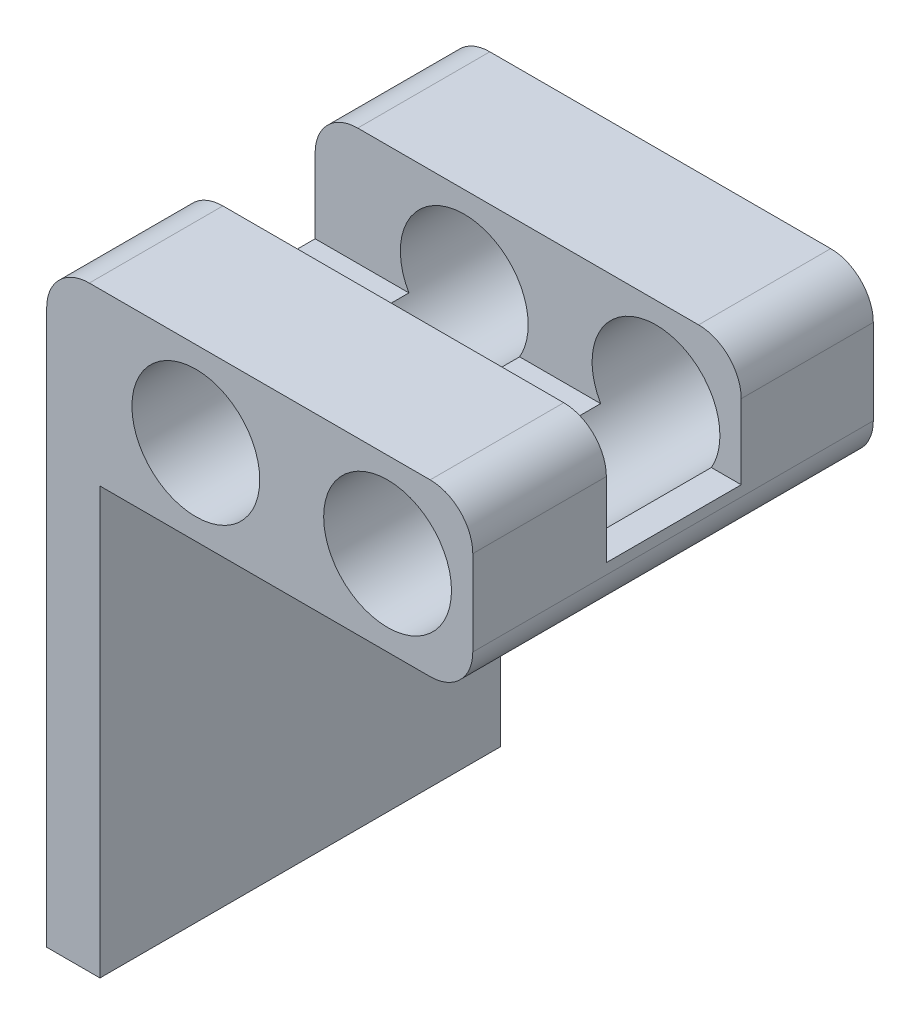
ISO-10303-21;
HEADER;
FILE_DESCRIPTION(('STEP AP214'),'2;1');
FILE_NAME('part.step','',(''),(''),'','','');
FILE_SCHEMA(('AUTOMOTIVE_DESIGN { 1 0 10303 214 1 1 1 1 }'));
ENDSEC;
DATA;
#1=APPLICATION_CONTEXT('core data for automotive mechanical design processes');
#2=APPLICATION_PROTOCOL_DEFINITION('international standard','automotive_design',2000,#1);
#3=PRODUCT_CONTEXT('',#1,'mechanical');
#4=PRODUCT('Part','Part','',(#3));
#5=PRODUCT_RELATED_PRODUCT_CATEGORY('part','',(#4));
#6=PRODUCT_DEFINITION_FORMATION('','',#4);
#7=PRODUCT_DEFINITION_CONTEXT('part definition',#1,'design');
#8=PRODUCT_DEFINITION('design','',#6,#7);
#9=PRODUCT_DEFINITION_SHAPE('','',#8);
#10=(LENGTH_UNIT() NAMED_UNIT(*) SI_UNIT(.MILLI.,.METRE.));
#11=(NAMED_UNIT(*) PLANE_ANGLE_UNIT() SI_UNIT($,.RADIAN.));
#12=(NAMED_UNIT(*) SI_UNIT($,.STERADIAN.) SOLID_ANGLE_UNIT());
#13=UNCERTAINTY_MEASURE_WITH_UNIT(LENGTH_MEASURE(1.E-05),#10,'distance_accuracy_value','');
#14=(GEOMETRIC_REPRESENTATION_CONTEXT(3) GLOBAL_UNCERTAINTY_ASSIGNED_CONTEXT((#13)) GLOBAL_UNIT_ASSIGNED_CONTEXT((#10,
#11,#12)) REPRESENTATION_CONTEXT('',''));
#15=CARTESIAN_POINT('',(0.,0.,0.));
#16=DIRECTION('',(0.,0.,1.));
#17=DIRECTION('',(1.,0.,0.));
#18=AXIS2_PLACEMENT_3D('',#15,#16,#17);
#19=CARTESIAN_POINT('',(0.,28.575,0.));
#20=DIRECTION('',(0.,1.,0.));
#21=DIRECTION('',(0.,0.,1.));
#22=AXIS2_PLACEMENT_3D('',#19,#20,#21);
#23=PLANE('',#22);
#24=DIRECTION('',(0.,0.,1.));
#25=VECTOR('',#24,1.);
#26=CARTESIAN_POINT('',(5.59044321158129,28.575,-23.876));
#27=LINE('',#26,#25);
#28=CARTESIAN_POINT('',(5.59044321158129,28.575,-16.002));
#29=VERTEX_POINT('',#28);
#30=CARTESIAN_POINT('',(5.59044321158129,28.575,-7.9629));
#31=VERTEX_POINT('',#30);
#32=EDGE_CURVE('E389',#29,#31,#27,.T.);
#33=ORIENTED_EDGE('',*,*,#32,.F.);
#34=DIRECTION('',(1.,0.,0.));
#35=VECTOR('',#34,1.);
#36=CARTESIAN_POINT('',(0.,28.575,-16.002));
#37=LINE('',#36,#35);
#38=CARTESIAN_POINT('',(0.,28.575,-16.002));
#39=VERTEX_POINT('',#38);
#40=EDGE_CURVE('E206',#39,#29,#37,.T.);
#41=ORIENTED_EDGE('',*,*,#40,.F.);
#42=DIRECTION('',(0.,0.,1.));
#43=VECTOR('',#42,1.);
#44=CARTESIAN_POINT('',(0.,28.575,-23.876));
#45=LINE('',#44,#43);
#46=CARTESIAN_POINT('',(0.,28.575,-7.9629));
#47=VERTEX_POINT('',#46);
#48=EDGE_CURVE('E240',#39,#47,#45,.T.);
#49=ORIENTED_EDGE('',*,*,#48,.T.);
#50=DIRECTION('',(-1.,0.,0.));
#51=VECTOR('',#50,1.);
#52=CARTESIAN_POINT('',(0.,28.575,-7.9629));
#53=LINE('',#52,#51);
#54=EDGE_CURVE('E211',#31,#47,#53,.T.);
#55=ORIENTED_EDGE('',*,*,#54,.F.);
#56=EDGE_LOOP('',(#33,#41,#49,#55));
#57=FACE_BOUND('',#56,.T.);
#58=ADVANCED_FACE('F43',(#57),#23,.T.);
#59=DIRECTION('',(0.,0.,1.));
#60=VECTOR('',#59,1.);
#61=CARTESIAN_POINT('',(12.1895567884187,28.575,-23.876));
#62=LINE('',#61,#60);
#63=CARTESIAN_POINT('',(12.1895567884187,28.575,-7.9629));
#64=VERTEX_POINT('',#63);
#65=CARTESIAN_POINT('',(12.1895567884187,28.575,-16.002));
#66=VERTEX_POINT('',#65);
#67=EDGE_CURVE('E403',#64,#66,#62,.F.);
#68=ORIENTED_EDGE('',*,*,#67,.F.);
#69=CARTESIAN_POINT('',(17.0204432115813,28.575,-7.9629));
#70=VERTEX_POINT('',#69);
#71=EDGE_CURVE('E197',#70,#64,#53,.T.);
#72=ORIENTED_EDGE('',*,*,#71,.F.);
#73=DIRECTION('',(0.,0.,1.));
#74=VECTOR('',#73,1.);
#75=CARTESIAN_POINT('',(17.0204432115813,28.575,-23.876));
#76=LINE('',#75,#74);
#77=CARTESIAN_POINT('',(17.0204432115813,28.575,-16.002));
#78=VERTEX_POINT('',#77);
#79=EDGE_CURVE('E178',#78,#70,#76,.T.);
#80=ORIENTED_EDGE('',*,*,#79,.F.);
#81=EDGE_CURVE('E195',#66,#78,#37,.T.);
#82=ORIENTED_EDGE('',*,*,#81,.F.);
#83=EDGE_LOOP('',(#68,#72,#80,#82));
#84=FACE_BOUND('',#83,.T.);
#85=ADVANCED_FACE('F194',(#84),#23,.T.);
#86=DIRECTION('',(0.,0.,1.));
#87=VECTOR('',#86,1.);
#88=CARTESIAN_POINT('',(23.6195567884187,28.575,-23.876));
#89=LINE('',#88,#87);
#90=CARTESIAN_POINT('',(23.6195567884187,28.575,-7.9629));
#91=VERTEX_POINT('',#90);
#92=CARTESIAN_POINT('',(23.6195567884187,28.575,-16.002));
#93=VERTEX_POINT('',#92);
#94=EDGE_CURVE('E181',#91,#93,#89,.F.);
#95=ORIENTED_EDGE('',*,*,#94,.F.);
#96=CARTESIAN_POINT('',(25.4,28.575,-7.9629));
#97=VERTEX_POINT('',#96);
#98=EDGE_CURVE('E227',#97,#91,#53,.T.);
#99=ORIENTED_EDGE('',*,*,#98,.F.);
#100=DIRECTION('',(0.,0.,-1.));
#101=VECTOR('',#100,1.);
#102=CARTESIAN_POINT('',(25.4,28.575,-23.876));
#103=LINE('',#102,#101);
#104=CARTESIAN_POINT('',(25.4,28.575,-16.002));
#105=VERTEX_POINT('',#104);
#106=EDGE_CURVE('E244',#97,#105,#103,.T.);
#107=ORIENTED_EDGE('',*,*,#106,.T.);
#108=EDGE_CURVE('E207',#93,#105,#37,.T.);
#109=ORIENTED_EDGE('',*,*,#108,.F.);
#110=EDGE_LOOP('',(#95,#99,#107,#109));
#111=FACE_BOUND('',#110,.T.);
#112=ADVANCED_FACE('F437',(#111),#23,.T.);
#113=CARTESIAN_POINT('',(3.175,0.,0.));
#114=DIRECTION('',(0.,0.,-1.));
#115=DIRECTION('',(-1.,0.,0.));
#116=AXIS2_PLACEMENT_3D('',#113,#114,#115);
#117=PLANE('',#116);
#118=CARTESIAN_POINT('',(8.89,30.48,0.));
#119=DIRECTION('',(0.,0.,-1.));
#120=DIRECTION('',(-1.,0.,0.));
#121=AXIS2_PLACEMENT_3D('',#118,#119,#120);
#122=CIRCLE('',#121,3.81);
#123=CARTESIAN_POINT('',(5.08,30.48,0.));
#124=VERTEX_POINT('',#123);
#125=EDGE_CURVE('E392',#124,#124,#122,.T.);
#126=ORIENTED_EDGE('',*,*,#125,.T.);
#127=EDGE_LOOP('',(#126));
#128=FACE_BOUND('',#127,.T.);
#129=CARTESIAN_POINT('',(20.32,30.48,0.));
#130=DIRECTION('',(0.,0.,-1.));
#131=DIRECTION('',(-1.,0.,0.));
#132=AXIS2_PLACEMENT_3D('',#129,#130,#131);
#133=CIRCLE('',#132,3.81);
#134=CARTESIAN_POINT('',(16.51,30.48,0.));
#135=VERTEX_POINT('',#134);
#136=EDGE_CURVE('E406',#135,#135,#133,.T.);
#137=ORIENTED_EDGE('',*,*,#136,.T.);
#138=EDGE_LOOP('',(#137));
#139=FACE_BOUND('',#138,.T.);
#140=DIRECTION('',(0.,-1.,0.));
#141=VECTOR('',#140,1.);
#142=CARTESIAN_POINT('',(25.4,28.575,0.));
#143=LINE('',#142,#141);
#144=CARTESIAN_POINT('',(25.4,33.02,0.));
#145=VERTEX_POINT('',#144);
#146=CARTESIAN_POINT('',(25.4,27.94,0.));
#147=VERTEX_POINT('',#146);
#148=EDGE_CURVE('E257',#145,#147,#143,.T.);
#149=ORIENTED_EDGE('',*,*,#148,.F.);
#150=CARTESIAN_POINT('',(22.86,33.02,0.));
#151=DIRECTION('',(0.,0.,-1.));
#152=DIRECTION('',(-1.,0.,0.));
#153=AXIS2_PLACEMENT_3D('',#150,#151,#152);
#154=CIRCLE('',#153,2.54);
#155=CARTESIAN_POINT('',(22.86,35.56,0.));
#156=VERTEX_POINT('',#155);
#157=EDGE_CURVE('E11',#145,#156,#154,.F.);
#158=ORIENTED_EDGE('',*,*,#157,.T.);
#159=DIRECTION('',(1.,0.,0.));
#160=VECTOR('',#159,1.);
#161=CARTESIAN_POINT('',(0.,35.56,0.));
#162=LINE('',#161,#160);
#163=CARTESIAN_POINT('',(2.54,35.56,0.));
#164=VERTEX_POINT('',#163);
#165=EDGE_CURVE('E223',#164,#156,#162,.T.);
#166=ORIENTED_EDGE('',*,*,#165,.F.);
#167=CARTESIAN_POINT('',(2.54,33.02,0.));
#168=DIRECTION('',(0.,0.,-1.));
#169=DIRECTION('',(-1.,0.,0.));
#170=AXIS2_PLACEMENT_3D('',#167,#168,#169);
#171=CIRCLE('',#170,2.54);
#172=CARTESIAN_POINT('',(0.,33.02,0.));
#173=VERTEX_POINT('',#172);
#174=EDGE_CURVE('E315',#164,#173,#171,.F.);
#175=ORIENTED_EDGE('',*,*,#174,.T.);
#176=DIRECTION('',(0.,-1.,0.));
#177=VECTOR('',#176,1.);
#178=CARTESIAN_POINT('',(0.,0.,0.));
#179=LINE('',#178,#177);
#180=CARTESIAN_POINT('',(0.,0.,0.));
#181=VERTEX_POINT('',#180);
#182=EDGE_CURVE('E260',#173,#181,#179,.T.);
#183=ORIENTED_EDGE('',*,*,#182,.T.);
#184=DIRECTION('',(-1.,0.,0.));
#185=VECTOR('',#184,1.);
#186=CARTESIAN_POINT('',(3.175,0.,0.));
#187=LINE('',#186,#185);
#188=CARTESIAN_POINT('',(3.175,0.,0.));
#189=VERTEX_POINT('',#188);
#190=EDGE_CURVE('E188',#189,#181,#187,.T.);
#191=ORIENTED_EDGE('',*,*,#190,.F.);
#192=DIRECTION('',(0.,-1.,0.));
#193=VECTOR('',#192,1.);
#194=CARTESIAN_POINT('',(3.175,0.,0.));
#195=LINE('',#194,#193);
#196=CARTESIAN_POINT('',(3.175,25.4,0.));
#197=VERTEX_POINT('',#196);
#198=EDGE_CURVE('E261',#197,#189,#195,.T.);
#199=ORIENTED_EDGE('',*,*,#198,.F.);
#200=DIRECTION('',(1.,0.,0.));
#201=VECTOR('',#200,1.);
#202=CARTESIAN_POINT('',(0.,25.4,0.));
#203=LINE('',#202,#201);
#204=CARTESIAN_POINT('',(22.86,25.4,0.));
#205=VERTEX_POINT('',#204);
#206=EDGE_CURVE('E239',#197,#205,#203,.T.);
#207=ORIENTED_EDGE('',*,*,#206,.T.);
#208=CARTESIAN_POINT('',(22.86,27.94,0.));
#209=DIRECTION('',(0.,0.,-1.));
#210=DIRECTION('',(-1.,0.,0.));
#211=AXIS2_PLACEMENT_3D('',#208,#209,#210);
#212=CIRCLE('',#211,2.54);
#213=EDGE_CURVE('E332',#205,#147,#212,.F.);
#214=ORIENTED_EDGE('',*,*,#213,.T.);
#215=EDGE_LOOP('',(#149,#158,#166,#175,#183,#191,#199,#207,#214));
#216=FACE_BOUND('',#215,.T.);
#217=ADVANCED_FACE('F367',(#128,#139,#216),#117,.F.);
#218=CARTESIAN_POINT('',(3.175,0.,0.));
#219=DIRECTION('',(0.,1.,0.));
#220=DIRECTION('',(0.,0.,1.));
#221=AXIS2_PLACEMENT_3D('',#218,#219,#220);
#222=PLANE('',#221);
#223=DIRECTION('',(0.,0.,-1.));
#224=VECTOR('',#223,1.);
#225=CARTESIAN_POINT('',(0.,0.,0.));
#226=LINE('',#225,#224);
#227=CARTESIAN_POINT('',(0.,0.,-23.876));
#228=VERTEX_POINT('',#227);
#229=EDGE_CURVE('E280',#181,#228,#226,.T.);
#230=ORIENTED_EDGE('',*,*,#229,.T.);
#231=DIRECTION('',(-1.,0.,0.));
#232=VECTOR('',#231,1.);
#233=CARTESIAN_POINT('',(3.175,0.,-23.876));
#234=LINE('',#233,#232);
#235=CARTESIAN_POINT('',(3.175,0.,-23.876));
#236=VERTEX_POINT('',#235);
#237=EDGE_CURVE('E277',#236,#228,#234,.T.);
#238=ORIENTED_EDGE('',*,*,#237,.F.);
#239=DIRECTION('',(0.,0.,-1.));
#240=VECTOR('',#239,1.);
#241=CARTESIAN_POINT('',(3.175,0.,0.));
#242=LINE('',#241,#240);
#243=EDGE_CURVE('E265',#189,#236,#242,.T.);
#244=ORIENTED_EDGE('',*,*,#243,.F.);
#245=ORIENTED_EDGE('',*,*,#190,.T.);
#246=EDGE_LOOP('',(#230,#238,#244,#245));
#247=FACE_BOUND('',#246,.T.);
#248=ADVANCED_FACE('F436',(#247),#222,.F.);
#249=CARTESIAN_POINT('',(3.175,0.,-23.876));
#250=DIRECTION('',(0.,0.,1.));
#251=DIRECTION('',(1.,0.,0.));
#252=AXIS2_PLACEMENT_3D('',#249,#250,#251);
#253=PLANE('',#252);
#254=CARTESIAN_POINT('',(8.89,30.48,-23.876));
#255=DIRECTION('',(0.,0.,1.));
#256=DIRECTION('',(1.,0.,0.));
#257=AXIS2_PLACEMENT_3D('',#254,#255,#256);
#258=CIRCLE('',#257,3.81);
#259=CARTESIAN_POINT('',(12.7,30.48,-23.876));
#260=VERTEX_POINT('',#259);
#261=EDGE_CURVE('E414',#260,#260,#258,.T.);
#262=ORIENTED_EDGE('',*,*,#261,.T.);
#263=EDGE_LOOP('',(#262));
#264=FACE_BOUND('',#263,.T.);
#265=CARTESIAN_POINT('',(20.32,30.48,-23.876));
#266=DIRECTION('',(0.,0.,1.));
#267=DIRECTION('',(1.,0.,0.));
#268=AXIS2_PLACEMENT_3D('',#265,#266,#267);
#269=CIRCLE('',#268,3.81);
#270=CARTESIAN_POINT('',(24.13,30.48,-23.876));
#271=VERTEX_POINT('',#270);
#272=EDGE_CURVE('E415',#271,#271,#269,.T.);
#273=ORIENTED_EDGE('',*,*,#272,.T.);
#274=EDGE_LOOP('',(#273));
#275=FACE_BOUND('',#274,.T.);
#276=DIRECTION('',(-1.,0.,0.));
#277=VECTOR('',#276,1.);
#278=CARTESIAN_POINT('',(0.,35.56,-23.876));
#279=LINE('',#278,#277);
#280=CARTESIAN_POINT('',(22.86,35.56,-23.876));
#281=VERTEX_POINT('',#280);
#282=CARTESIAN_POINT('',(2.54,35.56,-23.876));
#283=VERTEX_POINT('',#282);
#284=EDGE_CURVE('E217',#281,#283,#279,.T.);
#285=ORIENTED_EDGE('',*,*,#284,.F.);
#286=CARTESIAN_POINT('',(22.86,33.02,-23.876));
#287=DIRECTION('',(0.,0.,1.));
#288=DIRECTION('',(1.,0.,0.));
#289=AXIS2_PLACEMENT_3D('',#286,#287,#288);
#290=CIRCLE('',#289,2.54);
#291=CARTESIAN_POINT('',(25.4,33.02,-23.876));
#292=VERTEX_POINT('',#291);
#293=EDGE_CURVE('E340',#281,#292,#290,.F.);
#294=ORIENTED_EDGE('',*,*,#293,.T.);
#295=DIRECTION('',(0.,-1.,0.));
#296=VECTOR('',#295,1.);
#297=CARTESIAN_POINT('',(25.4,28.575,-23.876));
#298=LINE('',#297,#296);
#299=CARTESIAN_POINT('',(25.4,27.94,-23.876));
#300=VERTEX_POINT('',#299);
#301=EDGE_CURVE('E249',#292,#300,#298,.T.);
#302=ORIENTED_EDGE('',*,*,#301,.T.);
#303=CARTESIAN_POINT('',(22.86,27.94,-23.876));
#304=DIRECTION('',(0.,0.,1.));
#305=DIRECTION('',(1.,0.,0.));
#306=AXIS2_PLACEMENT_3D('',#303,#304,#305);
#307=CIRCLE('',#306,2.54);
#308=CARTESIAN_POINT('',(22.86,25.4,-23.876));
#309=VERTEX_POINT('',#308);
#310=EDGE_CURVE('E326',#300,#309,#307,.F.);
#311=ORIENTED_EDGE('',*,*,#310,.T.);
#312=DIRECTION('',(-1.,0.,0.));
#313=VECTOR('',#312,1.);
#314=CARTESIAN_POINT('',(0.,25.4,-23.876));
#315=LINE('',#314,#313);
#316=CARTESIAN_POINT('',(3.175,25.4,-23.876));
#317=VERTEX_POINT('',#316);
#318=EDGE_CURVE('E245',#309,#317,#315,.T.);
#319=ORIENTED_EDGE('',*,*,#318,.T.);
#320=DIRECTION('',(0.,1.,0.));
#321=VECTOR('',#320,1.);
#322=CARTESIAN_POINT('',(3.175,0.,-23.876));
#323=LINE('',#322,#321);
#324=EDGE_CURVE('E269',#236,#317,#323,.T.);
#325=ORIENTED_EDGE('',*,*,#324,.F.);
#326=ORIENTED_EDGE('',*,*,#237,.T.);
#327=DIRECTION('',(0.,1.,0.));
#328=VECTOR('',#327,1.);
#329=CARTESIAN_POINT('',(0.,0.,-23.876));
#330=LINE('',#329,#328);
#331=CARTESIAN_POINT('',(0.,33.02,-23.876));
#332=VERTEX_POINT('',#331);
#333=EDGE_CURVE('E266',#228,#332,#330,.T.);
#334=ORIENTED_EDGE('',*,*,#333,.T.);
#335=CARTESIAN_POINT('',(2.54,33.02,-23.876));
#336=DIRECTION('',(0.,0.,1.));
#337=DIRECTION('',(1.,0.,0.));
#338=AXIS2_PLACEMENT_3D('',#335,#336,#337);
#339=CIRCLE('',#338,2.54);
#340=EDGE_CURVE('E307',#332,#283,#339,.F.);
#341=ORIENTED_EDGE('',*,*,#340,.T.);
#342=EDGE_LOOP('',(#285,#294,#302,#311,#319,#325,#326,#334,#341));
#343=FACE_BOUND('',#342,.T.);
#344=ADVANCED_FACE('F423',(#264,#275,#343),#253,.F.);
#345=CARTESIAN_POINT('',(3.175,0.,0.));
#346=DIRECTION('',(-1.,0.,0.));
#347=DIRECTION('',(0.,0.,1.));
#348=AXIS2_PLACEMENT_3D('',#345,#346,#347);
#349=PLANE('',#348);
#350=ORIENTED_EDGE('',*,*,#198,.T.);
#351=ORIENTED_EDGE('',*,*,#243,.T.);
#352=ORIENTED_EDGE('',*,*,#324,.T.);
#353=DIRECTION('',(0.,0.,1.));
#354=VECTOR('',#353,1.);
#355=CARTESIAN_POINT('',(3.175,25.4,0.));
#356=LINE('',#355,#354);
#357=EDGE_CURVE('E273',#317,#197,#356,.T.);
#358=ORIENTED_EDGE('',*,*,#357,.T.);
#359=EDGE_LOOP('',(#350,#351,#352,#358));
#360=FACE_BOUND('',#359,.T.);
#361=ADVANCED_FACE('F551',(#360),#349,.F.);
#362=CARTESIAN_POINT('',(0.,0.,0.));
#363=DIRECTION('',(-1.,0.,0.));
#364=DIRECTION('',(0.,0.,1.));
#365=AXIS2_PLACEMENT_3D('',#362,#363,#364);
#366=PLANE('',#365);
#367=DIRECTION('',(0.,-1.,0.));
#368=VECTOR('',#367,1.);
#369=CARTESIAN_POINT('',(0.,35.56,-16.002));
#370=LINE('',#369,#368);
#371=CARTESIAN_POINT('',(0.,33.02,-16.002));
#372=VERTEX_POINT('',#371);
#373=EDGE_CURVE('E384',#372,#39,#370,.T.);
#374=ORIENTED_EDGE('',*,*,#373,.F.);
#375=DIRECTION('',(0.,0.,1.));
#376=VECTOR('',#375,1.);
#377=CARTESIAN_POINT('',(0.,33.02,0.));
#378=LINE('',#377,#376);
#379=EDGE_CURVE('E304',#372,#332,#378,.F.);
#380=ORIENTED_EDGE('',*,*,#379,.T.);
#381=ORIENTED_EDGE('',*,*,#333,.F.);
#382=ORIENTED_EDGE('',*,*,#229,.F.);
#383=ORIENTED_EDGE('',*,*,#182,.F.);
#384=DIRECTION('',(0.,0.,1.));
#385=VECTOR('',#384,1.);
#386=CARTESIAN_POINT('',(0.,33.02,-7.9629));
#387=LINE('',#386,#385);
#388=CARTESIAN_POINT('',(0.,33.02,-7.9629));
#389=VERTEX_POINT('',#388);
#390=EDGE_CURVE('E301',#173,#389,#387,.F.);
#391=ORIENTED_EDGE('',*,*,#390,.T.);
#392=DIRECTION('',(0.,-1.,0.));
#393=VECTOR('',#392,1.);
#394=CARTESIAN_POINT('',(0.,35.56,-7.9629));
#395=LINE('',#394,#393);
#396=EDGE_CURVE('E230',#389,#47,#395,.T.);
#397=ORIENTED_EDGE('',*,*,#396,.T.);
#398=ORIENTED_EDGE('',*,*,#48,.F.);
#399=EDGE_LOOP('',(#374,#380,#381,#382,#383,#391,#397,#398));
#400=FACE_BOUND('',#399,.T.);
#401=ADVANCED_FACE('F375',(#400),#366,.T.);
#402=CARTESIAN_POINT('',(25.4,28.575,-23.876));
#403=DIRECTION('',(-1.,0.,0.));
#404=DIRECTION('',(0.,0.,1.));
#405=AXIS2_PLACEMENT_3D('',#402,#403,#404);
#406=PLANE('',#405);
#407=ORIENTED_EDGE('',*,*,#301,.F.);
#408=DIRECTION('',(0.,0.,-1.));
#409=VECTOR('',#408,1.);
#410=CARTESIAN_POINT('',(25.4,33.02,-16.002));
#411=LINE('',#410,#409);
#412=CARTESIAN_POINT('',(25.4,33.02,-16.002));
#413=VERTEX_POINT('',#412);
#414=EDGE_CURVE('E346',#292,#413,#411,.F.);
#415=ORIENTED_EDGE('',*,*,#414,.T.);
#416=DIRECTION('',(0.,-1.,0.));
#417=VECTOR('',#416,1.);
#418=CARTESIAN_POINT('',(25.4,35.56,-16.002));
#419=LINE('',#418,#417);
#420=EDGE_CURVE('E215',#413,#105,#419,.T.);
#421=ORIENTED_EDGE('',*,*,#420,.T.);
#422=ORIENTED_EDGE('',*,*,#106,.F.);
#423=DIRECTION('',(0.,-1.,0.));
#424=VECTOR('',#423,1.);
#425=CARTESIAN_POINT('',(25.4,35.56,-7.9629));
#426=LINE('',#425,#424);
#427=CARTESIAN_POINT('',(25.4,33.02,-7.9629));
#428=VERTEX_POINT('',#427);
#429=EDGE_CURVE('E236',#428,#97,#426,.T.);
#430=ORIENTED_EDGE('',*,*,#429,.F.);
#431=DIRECTION('',(0.,0.,-1.));
#432=VECTOR('',#431,1.);
#433=CARTESIAN_POINT('',(25.4,33.02,-23.876));
#434=LINE('',#433,#432);
#435=EDGE_CURVE('E343',#428,#145,#434,.F.);
#436=ORIENTED_EDGE('',*,*,#435,.T.);
#437=ORIENTED_EDGE('',*,*,#148,.T.);
#438=DIRECTION('',(0.,0.,-1.));
#439=VECTOR('',#438,1.);
#440=CARTESIAN_POINT('',(25.4,27.94,-23.876));
#441=LINE('',#440,#439);
#442=EDGE_CURVE('E322',#147,#300,#441,.T.);
#443=ORIENTED_EDGE('',*,*,#442,.T.);
#444=EDGE_LOOP('',(#407,#415,#421,#422,#430,#436,#437,#443));
#445=FACE_BOUND('',#444,.T.);
#446=ADVANCED_FACE('F363',(#445),#406,.F.);
#447=CARTESIAN_POINT('',(0.,25.4,0.));
#448=DIRECTION('',(0.,1.,0.));
#449=DIRECTION('',(0.,0.,1.));
#450=AXIS2_PLACEMENT_3D('',#447,#448,#449);
#451=PLANE('',#450);
#452=ORIENTED_EDGE('',*,*,#318,.F.);
#453=DIRECTION('',(0.,0.,-1.));
#454=VECTOR('',#453,1.);
#455=CARTESIAN_POINT('',(22.86,25.4,0.));
#456=LINE('',#455,#454);
#457=EDGE_CURVE('E329',#309,#205,#456,.F.);
#458=ORIENTED_EDGE('',*,*,#457,.T.);
#459=ORIENTED_EDGE('',*,*,#206,.F.);
#460=ORIENTED_EDGE('',*,*,#357,.F.);
#461=EDGE_LOOP('',(#452,#458,#459,#460));
#462=FACE_BOUND('',#461,.T.);
#463=ADVANCED_FACE('F531',(#462),#451,.F.);
#464=CARTESIAN_POINT('',(0.,35.56,-7.9629));
#465=DIRECTION('',(0.,0.,1.));
#466=DIRECTION('',(1.,0.,0.));
#467=AXIS2_PLACEMENT_3D('',#464,#465,#466);
#468=PLANE('',#467);
#469=DIRECTION('',(-1.,0.,0.));
#470=VECTOR('',#469,1.);
#471=CARTESIAN_POINT('',(0.,35.56,-7.9629));
#472=LINE('',#471,#470);
#473=CARTESIAN_POINT('',(22.86,35.56,-7.9629));
#474=VERTEX_POINT('',#473);
#475=CARTESIAN_POINT('',(2.54,35.56,-7.9629));
#476=VERTEX_POINT('',#475);
#477=EDGE_CURVE('E226',#474,#476,#472,.T.);
#478=ORIENTED_EDGE('',*,*,#477,.F.);
#479=CARTESIAN_POINT('',(22.86,33.02,-7.9629));
#480=DIRECTION('',(0.,0.,1.));
#481=DIRECTION('',(1.,0.,0.));
#482=AXIS2_PLACEMENT_3D('',#479,#480,#481);
#483=CIRCLE('',#482,2.54);
#484=EDGE_CURVE('E52',#474,#428,#483,.F.);
#485=ORIENTED_EDGE('',*,*,#484,.T.);
#486=ORIENTED_EDGE('',*,*,#429,.T.);
#487=ORIENTED_EDGE('',*,*,#98,.T.);
#488=CARTESIAN_POINT('',(20.32,30.48,-7.9629));
#489=DIRECTION('',(0.,0.,1.));
#490=DIRECTION('',(1.,0.,0.));
#491=AXIS2_PLACEMENT_3D('',#488,#489,#490);
#492=CIRCLE('',#491,3.81);
#493=EDGE_CURVE('E199',#91,#70,#492,.T.);
#494=ORIENTED_EDGE('',*,*,#493,.T.);
#495=ORIENTED_EDGE('',*,*,#71,.T.);
#496=CARTESIAN_POINT('',(8.89,30.48,-7.9629));
#497=DIRECTION('',(0.,0.,1.));
#498=DIRECTION('',(1.,0.,0.));
#499=AXIS2_PLACEMENT_3D('',#496,#497,#498);
#500=CIRCLE('',#499,3.81);
#501=EDGE_CURVE('E396',#64,#31,#500,.T.);
#502=ORIENTED_EDGE('',*,*,#501,.T.);
#503=ORIENTED_EDGE('',*,*,#54,.T.);
#504=ORIENTED_EDGE('',*,*,#396,.F.);
#505=CARTESIAN_POINT('',(2.54,33.02,-7.9629));
#506=DIRECTION('',(0.,0.,1.));
#507=DIRECTION('',(1.,0.,0.));
#508=AXIS2_PLACEMENT_3D('',#505,#506,#507);
#509=CIRCLE('',#508,2.54);
#510=EDGE_CURVE('E318',#389,#476,#509,.F.);
#511=ORIENTED_EDGE('',*,*,#510,.T.);
#512=EDGE_LOOP('',(#478,#485,#486,#487,#494,#495,#502,#503,#504,#511));
#513=FACE_BOUND('',#512,.T.);
#514=ADVANCED_FACE('F358',(#513),#468,.F.);
#515=CARTESIAN_POINT('',(0.,35.56,0.));
#516=DIRECTION('',(0.,-1.,0.));
#517=DIRECTION('',(0.,0.,-1.));
#518=AXIS2_PLACEMENT_3D('',#515,#516,#517);
#519=PLANE('',#518);
#520=ORIENTED_EDGE('',*,*,#165,.T.);
#521=DIRECTION('',(0.,0.,-1.));
#522=VECTOR('',#521,1.);
#523=CARTESIAN_POINT('',(22.86,35.56,0.));
#524=LINE('',#523,#522);
#525=EDGE_CURVE('E352',#156,#474,#524,.T.);
#526=ORIENTED_EDGE('',*,*,#525,.T.);
#527=ORIENTED_EDGE('',*,*,#477,.T.);
#528=DIRECTION('',(0.,0.,1.));
#529=VECTOR('',#528,1.);
#530=CARTESIAN_POINT('',(2.54,35.56,0.));
#531=LINE('',#530,#529);
#532=EDGE_CURVE('E311',#476,#164,#531,.T.);
#533=ORIENTED_EDGE('',*,*,#532,.T.);
#534=EDGE_LOOP('',(#520,#526,#527,#533));
#535=FACE_BOUND('',#534,.T.);
#536=ADVANCED_FACE('F365',(#535),#519,.F.);
#537=CARTESIAN_POINT('',(0.,35.56,-16.002));
#538=DIRECTION('',(0.,0.,-1.));
#539=DIRECTION('',(-1.,0.,0.));
#540=AXIS2_PLACEMENT_3D('',#537,#538,#539);
#541=PLANE('',#540);
#542=ORIENTED_EDGE('',*,*,#420,.F.);
#543=CARTESIAN_POINT('',(22.86,33.02,-16.002));
#544=DIRECTION('',(0.,0.,-1.));
#545=DIRECTION('',(-1.,0.,0.));
#546=AXIS2_PLACEMENT_3D('',#543,#544,#545);
#547=CIRCLE('',#546,2.54);
#548=CARTESIAN_POINT('',(22.86,35.56,-16.002));
#549=VERTEX_POINT('',#548);
#550=EDGE_CURVE('E349',#413,#549,#547,.F.);
#551=ORIENTED_EDGE('',*,*,#550,.T.);
#552=DIRECTION('',(1.,0.,0.));
#553=VECTOR('',#552,1.);
#554=CARTESIAN_POINT('',(0.,35.56,-16.002));
#555=LINE('',#554,#553);
#556=CARTESIAN_POINT('',(2.54,35.56,-16.002));
#557=VERTEX_POINT('',#556);
#558=EDGE_CURVE('E212',#557,#549,#555,.T.);
#559=ORIENTED_EDGE('',*,*,#558,.F.);
#560=CARTESIAN_POINT('',(2.54,33.02,-16.002));
#561=DIRECTION('',(0.,0.,-1.));
#562=DIRECTION('',(-1.,0.,0.));
#563=AXIS2_PLACEMENT_3D('',#560,#561,#562);
#564=CIRCLE('',#563,2.54);
#565=EDGE_CURVE('E298',#557,#372,#564,.F.);
#566=ORIENTED_EDGE('',*,*,#565,.T.);
#567=ORIENTED_EDGE('',*,*,#373,.T.);
#568=ORIENTED_EDGE('',*,*,#40,.T.);
#569=CARTESIAN_POINT('',(8.89,30.48,-16.002));
#570=DIRECTION('',(0.,0.,-1.));
#571=DIRECTION('',(-1.,0.,0.));
#572=AXIS2_PLACEMENT_3D('',#569,#570,#571);
#573=CIRCLE('',#572,3.81);
#574=EDGE_CURVE('E187',#29,#66,#573,.T.);
#575=ORIENTED_EDGE('',*,*,#574,.T.);
#576=ORIENTED_EDGE('',*,*,#81,.T.);
#577=CARTESIAN_POINT('',(20.32,30.48,-16.002));
#578=DIRECTION('',(0.,0.,-1.));
#579=DIRECTION('',(-1.,0.,0.));
#580=AXIS2_PLACEMENT_3D('',#577,#578,#579);
#581=CIRCLE('',#580,3.81);
#582=EDGE_CURVE('E174',#78,#93,#581,.T.);
#583=ORIENTED_EDGE('',*,*,#582,.T.);
#584=ORIENTED_EDGE('',*,*,#108,.T.);
#585=EDGE_LOOP('',(#542,#551,#559,#566,#567,#568,#575,#576,#583,#584));
#586=FACE_BOUND('',#585,.T.);
#587=ADVANCED_FACE('F203',(#586),#541,.F.);
#588=CARTESIAN_POINT('',(0.,35.56,0.));
#589=DIRECTION('',(0.,1.,0.));
#590=DIRECTION('',(0.,0.,1.));
#591=AXIS2_PLACEMENT_3D('',#588,#589,#590);
#592=PLANE('',#591);
#593=ORIENTED_EDGE('',*,*,#558,.T.);
#594=DIRECTION('',(0.,0.,-1.));
#595=VECTOR('',#594,1.);
#596=CARTESIAN_POINT('',(22.86,35.56,-23.876));
#597=LINE('',#596,#595);
#598=EDGE_CURVE('E336',#549,#281,#597,.T.);
#599=ORIENTED_EDGE('',*,*,#598,.T.);
#600=ORIENTED_EDGE('',*,*,#284,.T.);
#601=DIRECTION('',(0.,0.,1.));
#602=VECTOR('',#601,1.);
#603=CARTESIAN_POINT('',(2.54,35.56,0.));
#604=LINE('',#603,#602);
#605=EDGE_CURVE('E294',#283,#557,#604,.T.);
#606=ORIENTED_EDGE('',*,*,#605,.T.);
#607=EDGE_LOOP('',(#593,#599,#600,#606));
#608=FACE_BOUND('',#607,.T.);
#609=ADVANCED_FACE('F442',(#608),#592,.T.);
#610=CARTESIAN_POINT('',(20.32,30.48,-23.876));
#611=DIRECTION('',(0.,0.,1.));
#612=DIRECTION('',(1.,0.,0.));
#613=AXIS2_PLACEMENT_3D('',#610,#611,#612);
#614=CYLINDRICAL_SURFACE('',#613,3.81);
#615=ORIENTED_EDGE('',*,*,#94,.T.);
#616=ORIENTED_EDGE('',*,*,#582,.F.);
#617=ORIENTED_EDGE('',*,*,#79,.T.);
#618=ORIENTED_EDGE('',*,*,#493,.F.);
#619=EDGE_LOOP('',(#615,#616,#617,#618));
#620=FACE_BOUND('',#619,.T.);
#621=ORIENTED_EDGE('',*,*,#272,.F.);
#622=EDGE_LOOP('',(#621));
#623=FACE_BOUND('',#622,.T.);
#624=ORIENTED_EDGE('',*,*,#136,.F.);
#625=EDGE_LOOP('',(#624));
#626=FACE_BOUND('',#625,.T.);
#627=ADVANCED_FACE('F176',(#620,#623,#626),#614,.F.);
#628=CARTESIAN_POINT('',(8.89,30.48,-23.876));
#629=DIRECTION('',(0.,0.,1.));
#630=DIRECTION('',(1.,0.,0.));
#631=AXIS2_PLACEMENT_3D('',#628,#629,#630);
#632=CYLINDRICAL_SURFACE('',#631,3.81);
#633=ORIENTED_EDGE('',*,*,#67,.T.);
#634=ORIENTED_EDGE('',*,*,#574,.F.);
#635=ORIENTED_EDGE('',*,*,#32,.T.);
#636=ORIENTED_EDGE('',*,*,#501,.F.);
#637=EDGE_LOOP('',(#633,#634,#635,#636));
#638=FACE_BOUND('',#637,.T.);
#639=ORIENTED_EDGE('',*,*,#261,.F.);
#640=EDGE_LOOP('',(#639));
#641=FACE_BOUND('',#640,.T.);
#642=ORIENTED_EDGE('',*,*,#125,.F.);
#643=EDGE_LOOP('',(#642));
#644=FACE_BOUND('',#643,.T.);
#645=ADVANCED_FACE('F426',(#638,#641,#644),#632,.F.);
#646=CARTESIAN_POINT('',(2.54,33.02,0.));
#647=DIRECTION('',(0.,0.,1.));
#648=DIRECTION('',(1.,0.,0.));
#649=AXIS2_PLACEMENT_3D('',#646,#647,#648);
#650=CYLINDRICAL_SURFACE('',#649,2.54);
#651=ORIENTED_EDGE('',*,*,#340,.F.);
#652=ORIENTED_EDGE('',*,*,#379,.F.);
#653=ORIENTED_EDGE('',*,*,#565,.F.);
#654=ORIENTED_EDGE('',*,*,#605,.F.);
#655=EDGE_LOOP('',(#651,#652,#653,#654));
#656=FACE_BOUND('',#655,.T.);
#657=ADVANCED_FACE('F429',(#656),#650,.T.);
#658=CARTESIAN_POINT('',(2.54,33.02,0.));
#659=DIRECTION('',(0.,0.,-1.));
#660=DIRECTION('',(-1.,0.,0.));
#661=AXIS2_PLACEMENT_3D('',#658,#659,#660);
#662=CYLINDRICAL_SURFACE('',#661,2.54);
#663=ORIENTED_EDGE('',*,*,#510,.F.);
#664=ORIENTED_EDGE('',*,*,#390,.F.);
#665=ORIENTED_EDGE('',*,*,#174,.F.);
#666=ORIENTED_EDGE('',*,*,#532,.F.);
#667=EDGE_LOOP('',(#663,#664,#665,#666));
#668=FACE_BOUND('',#667,.T.);
#669=ADVANCED_FACE('F379',(#668),#662,.T.);
#670=CARTESIAN_POINT('',(22.86,27.94,-23.876));
#671=DIRECTION('',(0.,0.,-1.));
#672=DIRECTION('',(-1.,0.,0.));
#673=AXIS2_PLACEMENT_3D('',#670,#671,#672);
#674=CYLINDRICAL_SURFACE('',#673,2.54);
#675=ORIENTED_EDGE('',*,*,#213,.F.);
#676=ORIENTED_EDGE('',*,*,#457,.F.);
#677=ORIENTED_EDGE('',*,*,#310,.F.);
#678=ORIENTED_EDGE('',*,*,#442,.F.);
#679=EDGE_LOOP('',(#675,#676,#677,#678));
#680=FACE_BOUND('',#679,.T.);
#681=ADVANCED_FACE('F478',(#680),#674,.T.);
#682=CARTESIAN_POINT('',(22.86,33.02,0.));
#683=DIRECTION('',(0.,0.,1.));
#684=DIRECTION('',(1.,0.,0.));
#685=AXIS2_PLACEMENT_3D('',#682,#683,#684);
#686=CYLINDRICAL_SURFACE('',#685,2.54);
#687=ORIENTED_EDGE('',*,*,#550,.F.);
#688=ORIENTED_EDGE('',*,*,#414,.F.);
#689=ORIENTED_EDGE('',*,*,#293,.F.);
#690=ORIENTED_EDGE('',*,*,#598,.F.);
#691=EDGE_LOOP('',(#687,#688,#689,#690));
#692=FACE_BOUND('',#691,.T.);
#693=ADVANCED_FACE('F467',(#692),#686,.T.);
#694=CARTESIAN_POINT('',(22.86,33.02,0.));
#695=DIRECTION('',(0.,0.,-1.));
#696=DIRECTION('',(-1.,0.,0.));
#697=AXIS2_PLACEMENT_3D('',#694,#695,#696);
#698=CYLINDRICAL_SURFACE('',#697,2.54);
#699=ORIENTED_EDGE('',*,*,#157,.F.);
#700=ORIENTED_EDGE('',*,*,#435,.F.);
#701=ORIENTED_EDGE('',*,*,#484,.F.);
#702=ORIENTED_EDGE('',*,*,#525,.F.);
#703=EDGE_LOOP('',(#699,#700,#701,#702));
#704=FACE_BOUND('',#703,.T.);
#705=ADVANCED_FACE('F45',(#704),#698,.T.);
#706=CLOSED_SHELL('',(#58,#85,#112,#217,#248,#344,#361,#401,#446,#463,#514,#536,#587,#609,#627,
#645,#657,#669,#681,#693,#705));
#707=MANIFOLD_SOLID_BREP('B2',#706);
#708=ADVANCED_BREP_SHAPE_REPRESENTATION('',(#18,#707),#14);
#709=SHAPE_DEFINITION_REPRESENTATION(#9,#708);
ENDSEC;
END-ISO-10303-21;
